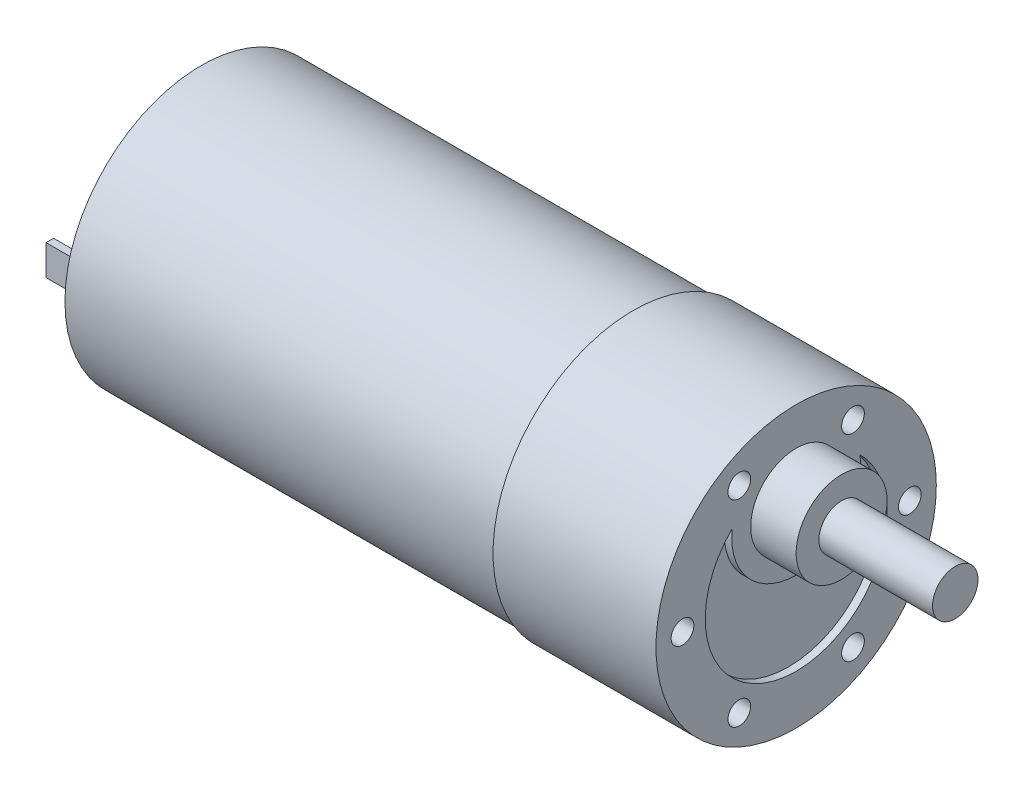
ISO-10303-21;
HEADER;
FILE_DESCRIPTION(('STEP AP214'),'2;1');
FILE_NAME('part.step','',(''),(''),'','','');
FILE_SCHEMA(('AUTOMOTIVE_DESIGN { 1 0 10303 214 1 1 1 1 }'));
ENDSEC;
DATA;
#1=APPLICATION_CONTEXT('core data for automotive mechanical design processes');
#2=APPLICATION_PROTOCOL_DEFINITION('international standard','automotive_design',2000,#1);
#3=PRODUCT_CONTEXT('',#1,'mechanical');
#4=PRODUCT('Part','Part','',(#3));
#5=PRODUCT_RELATED_PRODUCT_CATEGORY('part','',(#4));
#6=PRODUCT_DEFINITION_FORMATION('','',#4);
#7=PRODUCT_DEFINITION_CONTEXT('part definition',#1,'design');
#8=PRODUCT_DEFINITION('design','',#6,#7);
#9=PRODUCT_DEFINITION_SHAPE('','',#8);
#10=(LENGTH_UNIT() NAMED_UNIT(*) SI_UNIT(.MILLI.,.METRE.));
#11=(NAMED_UNIT(*) PLANE_ANGLE_UNIT() SI_UNIT($,.RADIAN.));
#12=(NAMED_UNIT(*) SI_UNIT($,.STERADIAN.) SOLID_ANGLE_UNIT());
#13=UNCERTAINTY_MEASURE_WITH_UNIT(LENGTH_MEASURE(1.E-05),#10,'distance_accuracy_value','');
#14=(GEOMETRIC_REPRESENTATION_CONTEXT(3) GLOBAL_UNCERTAINTY_ASSIGNED_CONTEXT((#13)) GLOBAL_UNIT_ASSIGNED_CONTEXT((#10,
#11,#12)) REPRESENTATION_CONTEXT('',''));
#15=CARTESIAN_POINT('',(0.,0.,0.));
#16=DIRECTION('',(0.,0.,1.));
#17=DIRECTION('',(1.,0.,0.));
#18=AXIS2_PLACEMENT_3D('',#15,#16,#17);
#19=CARTESIAN_POINT('',(21.5,0.,0.));
#20=DIRECTION('',(1.,0.,0.));
#21=DIRECTION('',(0.,0.,-1.));
#22=AXIS2_PLACEMENT_3D('',#19,#20,#21);
#23=PLANE('',#22);
#24=CARTESIAN_POINT('',(21.5,0.,15.));
#25=DIRECTION('',(1.,0.,0.));
#26=DIRECTION('',(0.,0.,-1.));
#27=AXIS2_PLACEMENT_3D('',#24,#25,#26);
#28=CIRCLE('',#27,1.5);
#29=CARTESIAN_POINT('',(21.5,0.,13.5));
#30=VERTEX_POINT('',#29);
#31=EDGE_CURVE('E423',#30,#30,#28,.T.);
#32=ORIENTED_EDGE('',*,*,#31,.F.);
#33=EDGE_LOOP('',(#32));
#34=FACE_BOUND('',#33,.T.);
#35=CARTESIAN_POINT('',(21.5,-12.9903810567665,7.50000000000015));
#36=DIRECTION('',(1.,0.,0.));
#37=DIRECTION('',(0.,0.,-1.));
#38=AXIS2_PLACEMENT_3D('',#35,#36,#37);
#39=CIRCLE('',#38,1.5);
#40=CARTESIAN_POINT('',(21.5,-12.9903810567665,6.00000000000014));
#41=VERTEX_POINT('',#40);
#42=EDGE_CURVE('E413',#41,#41,#39,.T.);
#43=ORIENTED_EDGE('',*,*,#42,.F.);
#44=EDGE_LOOP('',(#43));
#45=FACE_BOUND('',#44,.T.);
#46=CARTESIAN_POINT('',(21.5,-12.9903810567667,-7.49999999999988));
#47=DIRECTION('',(1.,0.,0.));
#48=DIRECTION('',(0.,0.,-1.));
#49=AXIS2_PLACEMENT_3D('',#46,#47,#48);
#50=CIRCLE('',#49,1.5);
#51=CARTESIAN_POINT('',(21.5,-12.9903810567667,-8.99999999999988));
#52=VERTEX_POINT('',#51);
#53=EDGE_CURVE('E403',#52,#52,#50,.T.);
#54=ORIENTED_EDGE('',*,*,#53,.F.);
#55=EDGE_LOOP('',(#54));
#56=FACE_BOUND('',#55,.T.);
#57=CARTESIAN_POINT('',(21.5,-1.02907469966573E-13,-15.));
#58=DIRECTION('',(1.,0.,0.));
#59=DIRECTION('',(0.,0.,-1.));
#60=AXIS2_PLACEMENT_3D('',#57,#58,#59);
#61=CIRCLE('',#60,1.5);
#62=CARTESIAN_POINT('',(21.5,-1.02907469966573E-13,-16.5));
#63=VERTEX_POINT('',#62);
#64=EDGE_CURVE('E410',#63,#63,#61,.T.);
#65=ORIENTED_EDGE('',*,*,#64,.F.);
#66=EDGE_LOOP('',(#65));
#67=FACE_BOUND('',#66,.T.);
#68=CARTESIAN_POINT('',(21.5,12.9903810567666,-7.50000000000006));
#69=DIRECTION('',(1.,0.,0.));
#70=DIRECTION('',(0.,0.,-1.));
#71=AXIS2_PLACEMENT_3D('',#68,#69,#70);
#72=CIRCLE('',#71,1.5);
#73=CARTESIAN_POINT('',(21.5,12.9903810567666,-9.00000000000006));
#74=VERTEX_POINT('',#73);
#75=EDGE_CURVE('E431',#74,#74,#72,.T.);
#76=ORIENTED_EDGE('',*,*,#75,.F.);
#77=EDGE_LOOP('',(#76));
#78=FACE_BOUND('',#77,.T.);
#79=CARTESIAN_POINT('',(21.5,12.9903810567666,7.49999999999997));
#80=DIRECTION('',(1.,0.,0.));
#81=DIRECTION('',(0.,0.,-1.));
#82=AXIS2_PLACEMENT_3D('',#79,#80,#81);
#83=CIRCLE('',#82,1.5);
#84=CARTESIAN_POINT('',(21.5,12.9903810567666,5.99999999999997));
#85=VERTEX_POINT('',#84);
#86=EDGE_CURVE('E435',#85,#85,#83,.T.);
#87=ORIENTED_EDGE('',*,*,#86,.F.);
#88=EDGE_LOOP('',(#87));
#89=FACE_BOUND('',#88,.T.);
#90=CARTESIAN_POINT('',(21.5,7.5,0.));
#91=DIRECTION('',(1.,0.,0.));
#92=DIRECTION('',(0.,0.,-1.));
#93=AXIS2_PLACEMENT_3D('',#90,#91,#92);
#94=CIRCLE('',#93,6.);
#95=CARTESIAN_POINT('',(21.5,7.5,-6.));
#96=VERTEX_POINT('',#95);
#97=EDGE_CURVE('E155',#96,#96,#94,.T.);
#98=ORIENTED_EDGE('',*,*,#97,.F.);
#99=EDGE_LOOP('',(#98));
#100=FACE_BOUND('',#99,.T.);
#101=CARTESIAN_POINT('',(21.5,0.,0.));
#102=DIRECTION('',(1.,0.,0.));
#103=DIRECTION('',(0.,0.,-1.));
#104=AXIS2_PLACEMENT_3D('',#101,#102,#103);
#105=CIRCLE('',#104,18.5);
#106=CARTESIAN_POINT('',(21.5,0.,-18.5));
#107=VERTEX_POINT('',#106);
#108=EDGE_CURVE('E51',#107,#107,#105,.T.);
#109=ORIENTED_EDGE('',*,*,#108,.T.);
#110=EDGE_LOOP('',(#109));
#111=FACE_BOUND('',#110,.T.);
#112=CARTESIAN_POINT('',(21.5,0.,0.));
#113=DIRECTION('',(1.,0.,0.));
#114=DIRECTION('',(0.,0.,-1.));
#115=AXIS2_PLACEMENT_3D('',#112,#113,#114);
#116=CIRCLE('',#115,12.);
#117=CARTESIAN_POINT('',(21.5,8.53333333333334,8.4369557437634));
#118=VERTEX_POINT('',#117);
#119=CARTESIAN_POINT('',(21.5,8.53333333333333,-8.4369557437634));
#120=VERTEX_POINT('',#119);
#121=EDGE_CURVE('E134',#118,#120,#116,.T.);
#122=ORIENTED_EDGE('',*,*,#121,.F.);
#123=CARTESIAN_POINT('',(21.5,7.5,0.));
#124=DIRECTION('',(1.,0.,0.));
#125=DIRECTION('',(0.,0.,-1.));
#126=AXIS2_PLACEMENT_3D('',#123,#124,#125);
#127=CIRCLE('',#126,8.5);
#128=EDGE_CURVE('E58',#118,#120,#127,.T.);
#129=ORIENTED_EDGE('',*,*,#128,.T.);
#130=EDGE_LOOP('',(#122,#129));
#131=FACE_BOUND('',#130,.T.);
#132=ADVANCED_FACE('F42',(#34,#45,#56,#67,#78,#89,#100,#111,#131),#23,.T.);
#133=CARTESIAN_POINT('',(-57.,0.,0.));
#134=DIRECTION('',(-1.,0.,0.));
#135=DIRECTION('',(0.,0.,1.));
#136=AXIS2_PLACEMENT_3D('',#133,#134,#135);
#137=PLANE('',#136);
#138=DIRECTION('',(0.,0.,-1.));
#139=VECTOR('',#138,1.);
#140=CARTESIAN_POINT('',(-57.,-2.00000000000001,-13.5));
#141=LINE('',#140,#139);
#142=CARTESIAN_POINT('',(-57.,-2.00000000000001,-13.5));
#143=VERTEX_POINT('',#142);
#144=CARTESIAN_POINT('',(-57.,-2.00000000000001,-14.5));
#145=VERTEX_POINT('',#144);
#146=EDGE_CURVE('E195',#143,#145,#141,.T.);
#147=ORIENTED_EDGE('',*,*,#146,.T.);
#148=DIRECTION('',(0.,1.,0.));
#149=VECTOR('',#148,1.);
#150=CARTESIAN_POINT('',(-57.,-2.00000000000001,-14.5));
#151=LINE('',#150,#149);
#152=CARTESIAN_POINT('',(-57.,1.99999999999999,-14.5));
#153=VERTEX_POINT('',#152);
#154=EDGE_CURVE('E225',#145,#153,#151,.T.);
#155=ORIENTED_EDGE('',*,*,#154,.T.);
#156=DIRECTION('',(0.,0.,-1.));
#157=VECTOR('',#156,1.);
#158=CARTESIAN_POINT('',(-57.,1.99999999999999,-13.5));
#159=LINE('',#158,#157);
#160=CARTESIAN_POINT('',(-57.,1.99999999999999,-13.5));
#161=VERTEX_POINT('',#160);
#162=EDGE_CURVE('E228',#161,#153,#159,.T.);
#163=ORIENTED_EDGE('',*,*,#162,.F.);
#164=DIRECTION('',(0.,1.,0.));
#165=VECTOR('',#164,1.);
#166=CARTESIAN_POINT('',(-57.,-2.00000000000001,-13.5));
#167=LINE('',#166,#165);
#168=EDGE_CURVE('E213',#143,#161,#167,.T.);
#169=ORIENTED_EDGE('',*,*,#168,.F.);
#170=EDGE_LOOP('',(#147,#155,#163,#169));
#171=FACE_BOUND('',#170,.T.);
#172=CARTESIAN_POINT('',(-57.,0.,0.));
#173=DIRECTION('',(-1.,0.,0.));
#174=DIRECTION('',(0.,0.,1.));
#175=AXIS2_PLACEMENT_3D('',#172,#173,#174);
#176=CIRCLE('',#175,18.);
#177=CARTESIAN_POINT('',(-57.,0.,-18.));
#178=VERTEX_POINT('',#177);
#179=EDGE_CURVE('E239',#178,#178,#176,.T.);
#180=ORIENTED_EDGE('',*,*,#179,.T.);
#181=EDGE_LOOP('',(#180));
#182=FACE_BOUND('',#181,.T.);
#183=DIRECTION('',(0.,1.,0.));
#184=VECTOR('',#183,1.);
#185=CARTESIAN_POINT('',(-57.,-2.,14.5));
#186=LINE('',#185,#184);
#187=CARTESIAN_POINT('',(-57.,-2.,14.5));
#188=VERTEX_POINT('',#187);
#189=CARTESIAN_POINT('',(-57.,2.,14.5));
#190=VERTEX_POINT('',#189);
#191=EDGE_CURVE('E66',#188,#190,#186,.T.);
#192=ORIENTED_EDGE('',*,*,#191,.F.);
#193=DIRECTION('',(0.,0.,1.));
#194=VECTOR('',#193,1.);
#195=CARTESIAN_POINT('',(-57.,-2.,13.5));
#196=LINE('',#195,#194);
#197=CARTESIAN_POINT('',(-57.,-2.,13.5));
#198=VERTEX_POINT('',#197);
#199=EDGE_CURVE('E191',#198,#188,#196,.T.);
#200=ORIENTED_EDGE('',*,*,#199,.F.);
#201=DIRECTION('',(0.,1.,0.));
#202=VECTOR('',#201,1.);
#203=CARTESIAN_POINT('',(-57.,-2.,13.5));
#204=LINE('',#203,#202);
#205=CARTESIAN_POINT('',(-57.,2.,13.5));
#206=VERTEX_POINT('',#205);
#207=EDGE_CURVE('E182',#198,#206,#204,.T.);
#208=ORIENTED_EDGE('',*,*,#207,.T.);
#209=DIRECTION('',(0.,0.,1.));
#210=VECTOR('',#209,1.);
#211=CARTESIAN_POINT('',(-57.,2.,13.5));
#212=LINE('',#211,#210);
#213=EDGE_CURVE('E185',#206,#190,#212,.T.);
#214=ORIENTED_EDGE('',*,*,#213,.T.);
#215=EDGE_LOOP('',(#192,#200,#208,#214));
#216=FACE_BOUND('',#215,.T.);
#217=ADVANCED_FACE('F273',(#171,#182,#216),#137,.T.);
#218=CARTESIAN_POINT('',(21.5,0.,0.));
#219=DIRECTION('',(-1.,0.,0.));
#220=DIRECTION('',(0.,0.,1.));
#221=AXIS2_PLACEMENT_3D('',#218,#219,#220);
#222=CYLINDRICAL_SURFACE('',#221,18.5);
#223=ORIENTED_EDGE('',*,*,#108,.F.);
#224=EDGE_LOOP('',(#223));
#225=FACE_BOUND('',#224,.T.);
#226=CARTESIAN_POINT('',(0.,0.,0.));
#227=DIRECTION('',(1.,0.,0.));
#228=DIRECTION('',(0.,0.,-1.));
#229=AXIS2_PLACEMENT_3D('',#226,#227,#228);
#230=CIRCLE('',#229,18.5);
#231=CARTESIAN_POINT('',(0.,0.,-18.5));
#232=VERTEX_POINT('',#231);
#233=EDGE_CURVE('E254',#232,#232,#230,.T.);
#234=ORIENTED_EDGE('',*,*,#233,.T.);
#235=EDGE_LOOP('',(#234));
#236=FACE_BOUND('',#235,.T.);
#237=ADVANCED_FACE('F44',(#225,#236),#222,.T.);
#238=CARTESIAN_POINT('',(0.,0.,0.));
#239=DIRECTION('',(1.,0.,0.));
#240=DIRECTION('',(0.,0.,-1.));
#241=AXIS2_PLACEMENT_3D('',#238,#239,#240);
#242=PLANE('',#241);
#243=CARTESIAN_POINT('',(0.,0.,0.));
#244=DIRECTION('',(1.,0.,0.));
#245=DIRECTION('',(0.,0.,-1.));
#246=AXIS2_PLACEMENT_3D('',#243,#244,#245);
#247=CIRCLE('',#246,18.);
#248=CARTESIAN_POINT('',(0.,0.,-18.));
#249=VERTEX_POINT('',#248);
#250=EDGE_CURVE('E11',#249,#249,#247,.F.);
#251=ORIENTED_EDGE('',*,*,#250,.F.);
#252=EDGE_LOOP('',(#251));
#253=FACE_BOUND('',#252,.T.);
#254=ORIENTED_EDGE('',*,*,#233,.F.);
#255=EDGE_LOOP('',(#254));
#256=FACE_BOUND('',#255,.T.);
#257=ADVANCED_FACE('F262',(#253,#256),#242,.F.);
#258=CARTESIAN_POINT('',(-57.,0.,0.));
#259=DIRECTION('',(1.,0.,0.));
#260=DIRECTION('',(0.,0.,-1.));
#261=AXIS2_PLACEMENT_3D('',#258,#259,#260);
#262=CYLINDRICAL_SURFACE('',#261,18.);
#263=CARTESIAN_POINT('',(-57.,0.,-18.));
#264=CARTESIAN_POINT('',(-56.40625,0.,-18.));
#265=CARTESIAN_POINT('',(-55.8125,0.,-18.));
#266=CARTESIAN_POINT('',(-54.625,0.,-18.));
#267=CARTESIAN_POINT('',(-54.03125,0.,-18.));
#268=CARTESIAN_POINT('',(-52.84375,0.,-18.));
#269=CARTESIAN_POINT('',(-52.25,0.,-18.));
#270=CARTESIAN_POINT('',(-51.0625,0.,-18.));
#271=CARTESIAN_POINT('',(-50.46875,0.,-18.));
#272=CARTESIAN_POINT('',(-49.28125,0.,-18.));
#273=CARTESIAN_POINT('',(-48.6875,0.,-18.));
#274=CARTESIAN_POINT('',(-47.5,0.,-18.));
#275=CARTESIAN_POINT('',(-46.90625,0.,-18.));
#276=CARTESIAN_POINT('',(-45.71875,0.,-18.));
#277=CARTESIAN_POINT('',(-45.125,0.,-18.));
#278=CARTESIAN_POINT('',(-43.9375,0.,-18.));
#279=CARTESIAN_POINT('',(-43.34375,0.,-18.));
#280=CARTESIAN_POINT('',(-42.15625,0.,-18.));
#281=CARTESIAN_POINT('',(-41.5625,0.,-18.));
#282=CARTESIAN_POINT('',(-40.375,0.,-18.));
#283=CARTESIAN_POINT('',(-39.78125,0.,-18.));
#284=CARTESIAN_POINT('',(-38.59375,0.,-18.));
#285=CARTESIAN_POINT('',(-38.,0.,-18.));
#286=CARTESIAN_POINT('',(-36.8125,0.,-18.));
#287=CARTESIAN_POINT('',(-36.21875,0.,-18.));
#288=CARTESIAN_POINT('',(-35.03125,0.,-18.));
#289=CARTESIAN_POINT('',(-34.4375,0.,-18.));
#290=CARTESIAN_POINT('',(-33.25,0.,-18.));
#291=CARTESIAN_POINT('',(-32.65625,0.,-18.));
#292=CARTESIAN_POINT('',(-31.46875,0.,-18.));
#293=CARTESIAN_POINT('',(-30.875,0.,-18.));
#294=CARTESIAN_POINT('',(-29.6875,0.,-18.));
#295=CARTESIAN_POINT('',(-29.09375,0.,-18.));
#296=CARTESIAN_POINT('',(-27.90625,0.,-18.));
#297=CARTESIAN_POINT('',(-27.3125,0.,-18.));
#298=CARTESIAN_POINT('',(-26.125,0.,-18.));
#299=CARTESIAN_POINT('',(-25.53125,0.,-18.));
#300=CARTESIAN_POINT('',(-24.34375,0.,-18.));
#301=CARTESIAN_POINT('',(-23.75,0.,-18.));
#302=CARTESIAN_POINT('',(-22.5625,0.,-18.));
#303=CARTESIAN_POINT('',(-21.96875,0.,-18.));
#304=CARTESIAN_POINT('',(-20.78125,0.,-18.));
#305=CARTESIAN_POINT('',(-20.1875,0.,-18.));
#306=CARTESIAN_POINT('',(-19.,0.,-18.));
#307=CARTESIAN_POINT('',(-18.40625,0.,-18.));
#308=CARTESIAN_POINT('',(-17.21875,0.,-18.));
#309=CARTESIAN_POINT('',(-16.625,0.,-18.));
#310=CARTESIAN_POINT('',(-15.4375,0.,-18.));
#311=CARTESIAN_POINT('',(-14.84375,0.,-18.));
#312=CARTESIAN_POINT('',(-13.65625,0.,-18.));
#313=CARTESIAN_POINT('',(-13.0625,0.,-18.));
#314=CARTESIAN_POINT('',(-11.875,0.,-18.));
#315=CARTESIAN_POINT('',(-11.28125,0.,-18.));
#316=CARTESIAN_POINT('',(-10.09375,0.,-18.));
#317=CARTESIAN_POINT('',(-9.5,0.,-18.));
#318=CARTESIAN_POINT('',(-8.3125,0.,-18.));
#319=CARTESIAN_POINT('',(-7.71875,0.,-18.));
#320=CARTESIAN_POINT('',(-6.53125,0.,-18.));
#321=CARTESIAN_POINT('',(-5.9375,0.,-18.));
#322=CARTESIAN_POINT('',(-4.75,0.,-18.));
#323=CARTESIAN_POINT('',(-4.15625,0.,-18.));
#324=CARTESIAN_POINT('',(-2.96875,0.,-18.));
#325=CARTESIAN_POINT('',(-2.375,0.,-18.));
#326=CARTESIAN_POINT('',(-1.1875,0.,-18.));
#327=CARTESIAN_POINT('',(-0.593749999999999,0.,-18.));
#328=CARTESIAN_POINT('',(0.,0.,-18.));
#329=B_SPLINE_CURVE_WITH_KNOTS('',3,(#263,#264,#265,#266,#267,#268,#269,#270,#271,#272,#273,
#274,#275,#276,#277,#278,#279,#280,#281,#282,#283,#284,#285,#286,#287,#288,#289,#290,#291,#292,
#293,#294,#295,#296,#297,#298,#299,#300,#301,#302,#303,#304,#305,#306,#307,#308,#309,#310,#311,
#312,#313,#314,#315,#316,#317,#318,#319,#320,#321,#322,#323,#324,#325,#326,#327,#328),
.UNSPECIFIED.,.F.,.F.,(4,2,2,2,2,2,2,2,2,2,2,2,2,2,2,2,2,2,2,2,2,2,2,2,2,2,2,2,2,2,2,2,4),(0.,
1.78125000000001,3.5625,5.34375,7.12500000000001,8.90625,10.6875,12.46875,14.25,16.03125,
17.8125,19.59375,21.375,23.15625,24.9375,26.71875,28.5,30.28125,32.0625,33.84375,35.625,
37.40625,39.1875,40.96875,42.75,44.53125,46.3125,48.09375,49.875,51.65625,53.4375,55.21875,57.),.UNSPECIFIED.);
#330=EDGE_CURVE('BSEAM264',#178,#249,#329,.T.);
#331=ORIENTED_EDGE('',*,*,#179,.F.);
#332=ORIENTED_EDGE('',*,*,#250,.T.);
#333=ORIENTED_EDGE('',*,*,#330,.T.);
#334=ORIENTED_EDGE('',*,*,#330,.F.);
#335=EDGE_LOOP('',(#331,#333,#332,#334));
#336=FACE_BOUND('',#335,.T.);
#337=ADVANCED_FACE('F264',(#336),#262,.T.);
#338=CARTESIAN_POINT('',(-63.,-2.00000000000001,-13.5));
#339=DIRECTION('',(0.,-1.,0.));
#340=DIRECTION('',(0.,0.,-1.));
#341=AXIS2_PLACEMENT_3D('',#338,#339,#340);
#342=PLANE('',#341);
#343=ORIENTED_EDGE('',*,*,#146,.F.);
#344=DIRECTION('',(1.,0.,0.));
#345=VECTOR('',#344,1.);
#346=CARTESIAN_POINT('',(-63.,-2.00000000000001,-13.5));
#347=LINE('',#346,#345);
#348=CARTESIAN_POINT('',(-63.,-2.00000000000001,-13.5));
#349=VERTEX_POINT('',#348);
#350=EDGE_CURVE('E235',#349,#143,#347,.T.);
#351=ORIENTED_EDGE('',*,*,#350,.F.);
#352=DIRECTION('',(0.,0.,-1.));
#353=VECTOR('',#352,1.);
#354=CARTESIAN_POINT('',(-63.,-2.00000000000001,-13.5));
#355=LINE('',#354,#353);
#356=CARTESIAN_POINT('',(-63.,-2.00000000000001,-14.5));
#357=VERTEX_POINT('',#356);
#358=EDGE_CURVE('E208',#349,#357,#355,.T.);
#359=ORIENTED_EDGE('',*,*,#358,.T.);
#360=DIRECTION('',(1.,0.,0.));
#361=VECTOR('',#360,1.);
#362=CARTESIAN_POINT('',(-63.,-2.00000000000001,-14.5));
#363=LINE('',#362,#361);
#364=EDGE_CURVE('E223',#357,#145,#363,.T.);
#365=ORIENTED_EDGE('',*,*,#364,.T.);
#366=EDGE_LOOP('',(#343,#351,#359,#365));
#367=FACE_BOUND('',#366,.T.);
#368=ADVANCED_FACE('F270',(#367),#342,.T.);
#369=CARTESIAN_POINT('',(-63.,-2.00000000000001,-13.5));
#370=DIRECTION('',(0.,0.,-1.));
#371=DIRECTION('',(-1.,0.,0.));
#372=AXIS2_PLACEMENT_3D('',#369,#370,#371);
#373=PLANE('',#372);
#374=ORIENTED_EDGE('',*,*,#168,.T.);
#375=DIRECTION('',(1.,0.,0.));
#376=VECTOR('',#375,1.);
#377=CARTESIAN_POINT('',(-63.,1.99999999999999,-13.5));
#378=LINE('',#377,#376);
#379=CARTESIAN_POINT('',(-63.,1.99999999999999,-13.5));
#380=VERTEX_POINT('',#379);
#381=EDGE_CURVE('E240',#380,#161,#378,.T.);
#382=ORIENTED_EDGE('',*,*,#381,.F.);
#383=DIRECTION('',(0.,1.,0.));
#384=VECTOR('',#383,1.);
#385=CARTESIAN_POINT('',(-63.,-2.00000000000001,-13.5));
#386=LINE('',#385,#384);
#387=EDGE_CURVE('E220',#349,#380,#386,.T.);
#388=ORIENTED_EDGE('',*,*,#387,.F.);
#389=ORIENTED_EDGE('',*,*,#350,.T.);
#390=EDGE_LOOP('',(#374,#382,#388,#389));
#391=FACE_BOUND('',#390,.T.);
#392=ADVANCED_FACE('F289',(#391),#373,.F.);
#393=CARTESIAN_POINT('',(-63.,1.99999999999999,-13.5));
#394=DIRECTION('',(0.,-1.,0.));
#395=DIRECTION('',(0.,0.,-1.));
#396=AXIS2_PLACEMENT_3D('',#393,#394,#395);
#397=PLANE('',#396);
#398=ORIENTED_EDGE('',*,*,#162,.T.);
#399=DIRECTION('',(1.,0.,0.));
#400=VECTOR('',#399,1.);
#401=CARTESIAN_POINT('',(-63.,1.99999999999999,-14.5));
#402=LINE('',#401,#400);
#403=CARTESIAN_POINT('',(-63.,1.99999999999999,-14.5));
#404=VERTEX_POINT('',#403);
#405=EDGE_CURVE('E244',#404,#153,#402,.T.);
#406=ORIENTED_EDGE('',*,*,#405,.F.);
#407=DIRECTION('',(0.,0.,-1.));
#408=VECTOR('',#407,1.);
#409=CARTESIAN_POINT('',(-63.,1.99999999999999,-13.5));
#410=LINE('',#409,#408);
#411=EDGE_CURVE('E217',#380,#404,#410,.T.);
#412=ORIENTED_EDGE('',*,*,#411,.F.);
#413=ORIENTED_EDGE('',*,*,#381,.T.);
#414=EDGE_LOOP('',(#398,#406,#412,#413));
#415=FACE_BOUND('',#414,.T.);
#416=ADVANCED_FACE('F295',(#415),#397,.F.);
#417=CARTESIAN_POINT('',(-63.,-2.00000000000001,-14.5));
#418=DIRECTION('',(0.,0.,-1.));
#419=DIRECTION('',(-1.,0.,0.));
#420=AXIS2_PLACEMENT_3D('',#417,#418,#419);
#421=PLANE('',#420);
#422=ORIENTED_EDGE('',*,*,#154,.F.);
#423=ORIENTED_EDGE('',*,*,#364,.F.);
#424=DIRECTION('',(0.,1.,0.));
#425=VECTOR('',#424,1.);
#426=CARTESIAN_POINT('',(-63.,-2.00000000000001,-14.5));
#427=LINE('',#426,#425);
#428=EDGE_CURVE('E212',#357,#404,#427,.T.);
#429=ORIENTED_EDGE('',*,*,#428,.T.);
#430=ORIENTED_EDGE('',*,*,#405,.T.);
#431=EDGE_LOOP('',(#422,#423,#429,#430));
#432=FACE_BOUND('',#431,.T.);
#433=ADVANCED_FACE('F291',(#432),#421,.T.);
#434=CARTESIAN_POINT('',(-63.,0.,0.));
#435=DIRECTION('',(1.,0.,0.));
#436=DIRECTION('',(0.,0.,-1.));
#437=AXIS2_PLACEMENT_3D('',#434,#435,#436);
#438=PLANE('',#437);
#439=ORIENTED_EDGE('',*,*,#358,.F.);
#440=ORIENTED_EDGE('',*,*,#387,.T.);
#441=ORIENTED_EDGE('',*,*,#411,.T.);
#442=ORIENTED_EDGE('',*,*,#428,.F.);
#443=EDGE_LOOP('',(#439,#440,#441,#442));
#444=FACE_BOUND('',#443,.T.);
#445=ADVANCED_FACE('F294',(#444),#438,.F.);
#446=CARTESIAN_POINT('',(-63.,-2.,13.5));
#447=DIRECTION('',(0.,1.,0.));
#448=DIRECTION('',(0.,0.,1.));
#449=AXIS2_PLACEMENT_3D('',#446,#447,#448);
#450=PLANE('',#449);
#451=ORIENTED_EDGE('',*,*,#199,.T.);
#452=DIRECTION('',(1.,0.,0.));
#453=VECTOR('',#452,1.);
#454=CARTESIAN_POINT('',(-63.,-2.,14.5));
#455=LINE('',#454,#453);
#456=CARTESIAN_POINT('',(-63.,-2.,14.5));
#457=VERTEX_POINT('',#456);
#458=EDGE_CURVE('E163',#457,#188,#455,.T.);
#459=ORIENTED_EDGE('',*,*,#458,.F.);
#460=DIRECTION('',(0.,0.,1.));
#461=VECTOR('',#460,1.);
#462=CARTESIAN_POINT('',(-63.,-2.,13.5));
#463=LINE('',#462,#461);
#464=CARTESIAN_POINT('',(-63.,-2.,13.5));
#465=VERTEX_POINT('',#464);
#466=EDGE_CURVE('E186',#465,#457,#463,.T.);
#467=ORIENTED_EDGE('',*,*,#466,.F.);
#468=DIRECTION('',(1.,0.,0.));
#469=VECTOR('',#468,1.);
#470=CARTESIAN_POINT('',(-63.,-2.,13.5));
#471=LINE('',#470,#469);
#472=EDGE_CURVE('E177',#465,#198,#471,.T.);
#473=ORIENTED_EDGE('',*,*,#472,.T.);
#474=EDGE_LOOP('',(#451,#459,#467,#473));
#475=FACE_BOUND('',#474,.T.);
#476=ADVANCED_FACE('F305',(#475),#450,.F.);
#477=CARTESIAN_POINT('',(-63.,-2.,14.5));
#478=DIRECTION('',(0.,0.,-1.));
#479=DIRECTION('',(-1.,0.,0.));
#480=AXIS2_PLACEMENT_3D('',#477,#478,#479);
#481=PLANE('',#480);
#482=ORIENTED_EDGE('',*,*,#191,.T.);
#483=DIRECTION('',(1.,0.,0.));
#484=VECTOR('',#483,1.);
#485=CARTESIAN_POINT('',(-63.,2.,14.5));
#486=LINE('',#485,#484);
#487=CARTESIAN_POINT('',(-63.,2.,14.5));
#488=VERTEX_POINT('',#487);
#489=EDGE_CURVE('E169',#488,#190,#486,.T.);
#490=ORIENTED_EDGE('',*,*,#489,.F.);
#491=DIRECTION('',(0.,1.,0.));
#492=VECTOR('',#491,1.);
#493=CARTESIAN_POINT('',(-63.,-2.,14.5));
#494=LINE('',#493,#492);
#495=EDGE_CURVE('E203',#457,#488,#494,.T.);
#496=ORIENTED_EDGE('',*,*,#495,.F.);
#497=ORIENTED_EDGE('',*,*,#458,.T.);
#498=EDGE_LOOP('',(#482,#490,#496,#497));
#499=FACE_BOUND('',#498,.T.);
#500=ADVANCED_FACE('F319',(#499),#481,.F.);
#501=CARTESIAN_POINT('',(-63.,2.,13.5));
#502=DIRECTION('',(0.,1.,0.));
#503=DIRECTION('',(0.,0.,1.));
#504=AXIS2_PLACEMENT_3D('',#501,#502,#503);
#505=PLANE('',#504);
#506=ORIENTED_EDGE('',*,*,#213,.F.);
#507=DIRECTION('',(1.,0.,0.));
#508=VECTOR('',#507,1.);
#509=CARTESIAN_POINT('',(-63.,2.,13.5));
#510=LINE('',#509,#508);
#511=CARTESIAN_POINT('',(-63.,2.,13.5));
#512=VERTEX_POINT('',#511);
#513=EDGE_CURVE('E173',#512,#206,#510,.T.);
#514=ORIENTED_EDGE('',*,*,#513,.F.);
#515=DIRECTION('',(0.,0.,1.));
#516=VECTOR('',#515,1.);
#517=CARTESIAN_POINT('',(-63.,2.,13.5));
#518=LINE('',#517,#516);
#519=EDGE_CURVE('E199',#512,#488,#518,.T.);
#520=ORIENTED_EDGE('',*,*,#519,.T.);
#521=ORIENTED_EDGE('',*,*,#489,.T.);
#522=EDGE_LOOP('',(#506,#514,#520,#521));
#523=FACE_BOUND('',#522,.T.);
#524=ADVANCED_FACE('F315',(#523),#505,.T.);
#525=CARTESIAN_POINT('',(-63.,-2.,13.5));
#526=DIRECTION('',(0.,0.,-1.));
#527=DIRECTION('',(-1.,0.,0.));
#528=AXIS2_PLACEMENT_3D('',#525,#526,#527);
#529=PLANE('',#528);
#530=ORIENTED_EDGE('',*,*,#207,.F.);
#531=ORIENTED_EDGE('',*,*,#472,.F.);
#532=DIRECTION('',(0.,1.,0.));
#533=VECTOR('',#532,1.);
#534=CARTESIAN_POINT('',(-63.,-2.,13.5));
#535=LINE('',#534,#533);
#536=EDGE_CURVE('E181',#465,#512,#535,.T.);
#537=ORIENTED_EDGE('',*,*,#536,.T.);
#538=ORIENTED_EDGE('',*,*,#513,.T.);
#539=EDGE_LOOP('',(#530,#531,#537,#538));
#540=FACE_BOUND('',#539,.T.);
#541=ADVANCED_FACE('F311',(#540),#529,.T.);
#542=CARTESIAN_POINT('',(-63.,0.,0.));
#543=DIRECTION('',(-1.,0.,0.));
#544=DIRECTION('',(0.,0.,1.));
#545=AXIS2_PLACEMENT_3D('',#542,#543,#544);
#546=PLANE('',#545);
#547=ORIENTED_EDGE('',*,*,#466,.T.);
#548=ORIENTED_EDGE('',*,*,#495,.T.);
#549=ORIENTED_EDGE('',*,*,#519,.F.);
#550=ORIENTED_EDGE('',*,*,#536,.F.);
#551=EDGE_LOOP('',(#547,#548,#549,#550));
#552=FACE_BOUND('',#551,.T.);
#553=ADVANCED_FACE('F307',(#552),#546,.T.);
#554=CARTESIAN_POINT('',(27.5,7.5,0.));
#555=DIRECTION('',(-1.,0.,0.));
#556=DIRECTION('',(0.,0.,1.));
#557=AXIS2_PLACEMENT_3D('',#554,#555,#556);
#558=CYLINDRICAL_SURFACE('',#557,6.);
#559=CARTESIAN_POINT('',(27.5,7.5,0.));
#560=DIRECTION('',(1.,0.,0.));
#561=DIRECTION('',(0.,0.,-1.));
#562=AXIS2_PLACEMENT_3D('',#559,#560,#561);
#563=CIRCLE('',#562,6.);
#564=CARTESIAN_POINT('',(27.5,7.5,-6.));
#565=VERTEX_POINT('',#564);
#566=EDGE_CURVE('E159',#565,#565,#563,.T.);
#567=ORIENTED_EDGE('',*,*,#566,.F.);
#568=EDGE_LOOP('',(#567));
#569=FACE_BOUND('',#568,.T.);
#570=ORIENTED_EDGE('',*,*,#97,.T.);
#571=EDGE_LOOP('',(#570));
#572=FACE_BOUND('',#571,.T.);
#573=ADVANCED_FACE('F310',(#569,#572),#558,.T.);
#574=CARTESIAN_POINT('',(27.5,0.,0.));
#575=DIRECTION('',(1.,0.,0.));
#576=DIRECTION('',(0.,0.,-1.));
#577=AXIS2_PLACEMENT_3D('',#574,#575,#576);
#578=PLANE('',#577);
#579=CARTESIAN_POINT('',(27.5,7.5,0.));
#580=DIRECTION('',(1.,0.,0.));
#581=DIRECTION('',(0.,0.,-1.));
#582=AXIS2_PLACEMENT_3D('',#579,#580,#581);
#583=CIRCLE('',#582,3.);
#584=CARTESIAN_POINT('',(27.5,7.5,-3.));
#585=VERTEX_POINT('',#584);
#586=EDGE_CURVE('E149',#585,#585,#583,.T.);
#587=ORIENTED_EDGE('',*,*,#586,.F.);
#588=EDGE_LOOP('',(#587));
#589=FACE_BOUND('',#588,.T.);
#590=ORIENTED_EDGE('',*,*,#566,.T.);
#591=EDGE_LOOP('',(#590));
#592=FACE_BOUND('',#591,.T.);
#593=ADVANCED_FACE('F329',(#589,#592),#578,.T.);
#594=CARTESIAN_POINT('',(42.5,7.5,0.));
#595=DIRECTION('',(-1.,0.,0.));
#596=DIRECTION('',(0.,0.,1.));
#597=AXIS2_PLACEMENT_3D('',#594,#595,#596);
#598=CYLINDRICAL_SURFACE('',#597,3.);
#599=CARTESIAN_POINT('',(42.5,7.5,0.));
#600=DIRECTION('',(1.,0.,0.));
#601=DIRECTION('',(0.,0.,-1.));
#602=AXIS2_PLACEMENT_3D('',#599,#600,#601);
#603=CIRCLE('',#602,3.);
#604=CARTESIAN_POINT('',(42.5,7.5,-3.));
#605=VERTEX_POINT('',#604);
#606=EDGE_CURVE('E151',#605,#605,#603,.T.);
#607=ORIENTED_EDGE('',*,*,#606,.F.);
#608=EDGE_LOOP('',(#607));
#609=FACE_BOUND('',#608,.T.);
#610=ORIENTED_EDGE('',*,*,#586,.T.);
#611=EDGE_LOOP('',(#610));
#612=FACE_BOUND('',#611,.T.);
#613=ADVANCED_FACE('F333',(#609,#612),#598,.T.);
#614=CARTESIAN_POINT('',(42.5,7.5,0.));
#615=DIRECTION('',(1.,0.,0.));
#616=DIRECTION('',(0.,0.,-1.));
#617=AXIS2_PLACEMENT_3D('',#614,#615,#616);
#618=PLANE('',#617);
#619=ORIENTED_EDGE('',*,*,#606,.T.);
#620=EDGE_LOOP('',(#619));
#621=FACE_BOUND('',#620,.T.);
#622=ADVANCED_FACE('F337',(#621),#618,.T.);
#623=CARTESIAN_POINT('',(20.5,7.5,0.));
#624=DIRECTION('',(1.,0.,0.));
#625=DIRECTION('',(0.,0.,-1.));
#626=AXIS2_PLACEMENT_3D('',#623,#624,#625);
#627=CYLINDRICAL_SURFACE('',#626,8.5);
#628=ORIENTED_EDGE('',*,*,#128,.F.);
#629=DIRECTION('',(1.,0.,0.));
#630=VECTOR('',#629,1.);
#631=CARTESIAN_POINT('',(20.5,8.53333333333334,8.4369557437634));
#632=LINE('',#631,#630);
#633=CARTESIAN_POINT('',(20.5,8.53333333333334,8.4369557437634));
#634=VERTEX_POINT('',#633);
#635=EDGE_CURVE('E117',#634,#118,#632,.T.);
#636=ORIENTED_EDGE('',*,*,#635,.F.);
#637=CARTESIAN_POINT('',(20.5,7.5,0.));
#638=DIRECTION('',(1.,0.,0.));
#639=DIRECTION('',(0.,0.,-1.));
#640=AXIS2_PLACEMENT_3D('',#637,#638,#639);
#641=CIRCLE('',#640,8.5);
#642=CARTESIAN_POINT('',(20.5,8.53333333333333,-8.4369557437634));
#643=VERTEX_POINT('',#642);
#644=EDGE_CURVE('E120',#634,#643,#641,.T.);
#645=ORIENTED_EDGE('',*,*,#644,.T.);
#646=DIRECTION('',(1.,0.,0.));
#647=VECTOR('',#646,1.);
#648=CARTESIAN_POINT('',(20.5,8.53333333333333,-8.4369557437634));
#649=LINE('',#648,#647);
#650=EDGE_CURVE('E127',#643,#120,#649,.T.);
#651=ORIENTED_EDGE('',*,*,#650,.T.);
#652=EDGE_LOOP('',(#628,#636,#645,#651));
#653=FACE_BOUND('',#652,.T.);
#654=ADVANCED_FACE('F119',(#653),#627,.T.);
#655=CARTESIAN_POINT('',(20.5,0.,0.));
#656=DIRECTION('',(1.,0.,0.));
#657=DIRECTION('',(0.,0.,-1.));
#658=AXIS2_PLACEMENT_3D('',#655,#656,#657);
#659=CYLINDRICAL_SURFACE('',#658,12.);
#660=ORIENTED_EDGE('',*,*,#121,.T.);
#661=ORIENTED_EDGE('',*,*,#650,.F.);
#662=CARTESIAN_POINT('',(20.5,0.,0.));
#663=DIRECTION('',(1.,0.,0.));
#664=DIRECTION('',(0.,0.,-1.));
#665=AXIS2_PLACEMENT_3D('',#662,#663,#664);
#666=CIRCLE('',#665,12.);
#667=EDGE_CURVE('E128',#634,#643,#666,.T.);
#668=ORIENTED_EDGE('',*,*,#667,.F.);
#669=ORIENTED_EDGE('',*,*,#635,.T.);
#670=EDGE_LOOP('',(#660,#661,#668,#669));
#671=FACE_BOUND('',#670,.T.);
#672=ADVANCED_FACE('F136',(#671),#659,.F.);
#673=CARTESIAN_POINT('',(20.5,0.,0.));
#674=DIRECTION('',(1.,0.,0.));
#675=DIRECTION('',(0.,0.,-1.));
#676=AXIS2_PLACEMENT_3D('',#673,#674,#675);
#677=PLANE('',#676);
#678=ORIENTED_EDGE('',*,*,#644,.F.);
#679=ORIENTED_EDGE('',*,*,#667,.T.);
#680=EDGE_LOOP('',(#678,#679));
#681=FACE_BOUND('',#680,.T.);
#682=ADVANCED_FACE('F132',(#681),#677,.T.);
#683=CARTESIAN_POINT('',(16.5,12.9903810567666,7.49999999999997));
#684=DIRECTION('',(1.,0.,0.));
#685=DIRECTION('',(0.,0.,-1.));
#686=AXIS2_PLACEMENT_3D('',#683,#684,#685);
#687=CYLINDRICAL_SURFACE('',#686,1.5);
#688=CARTESIAN_POINT('',(16.5,12.9903810567666,7.49999999999997));
#689=DIRECTION('',(1.,0.,0.));
#690=DIRECTION('',(0.,0.,-1.));
#691=AXIS2_PLACEMENT_3D('',#688,#689,#690);
#692=CIRCLE('',#691,1.5);
#693=CARTESIAN_POINT('',(16.5,12.9903810567666,5.99999999999997));
#694=VERTEX_POINT('',#693);
#695=EDGE_CURVE('E145',#694,#694,#692,.T.);
#696=ORIENTED_EDGE('',*,*,#695,.F.);
#697=EDGE_LOOP('',(#696));
#698=FACE_BOUND('',#697,.T.);
#699=ORIENTED_EDGE('',*,*,#86,.T.);
#700=EDGE_LOOP('',(#699));
#701=FACE_BOUND('',#700,.T.);
#702=ADVANCED_FACE('F348',(#698,#701),#687,.F.);
#703=CARTESIAN_POINT('',(16.5,12.9903810567666,7.49999999999997));
#704=DIRECTION('',(1.,0.,0.));
#705=DIRECTION('',(0.,0.,-1.));
#706=AXIS2_PLACEMENT_3D('',#703,#704,#705);
#707=PLANE('',#706);
#708=ORIENTED_EDGE('',*,*,#695,.T.);
#709=EDGE_LOOP('',(#708));
#710=FACE_BOUND('',#709,.T.);
#711=ADVANCED_FACE('F351',(#710),#707,.T.);
#712=CARTESIAN_POINT('',(16.5,12.9903810567666,-7.50000000000006));
#713=DIRECTION('',(1.,0.,0.));
#714=DIRECTION('',(0.,0.,-1.));
#715=AXIS2_PLACEMENT_3D('',#712,#713,#714);
#716=CYLINDRICAL_SURFACE('',#715,1.5);
#717=CARTESIAN_POINT('',(16.5,12.9903810567666,-7.50000000000006));
#718=DIRECTION('',(1.,0.,0.));
#719=DIRECTION('',(0.,0.,-1.));
#720=AXIS2_PLACEMENT_3D('',#717,#718,#719);
#721=CIRCLE('',#720,1.5);
#722=CARTESIAN_POINT('',(16.5,12.9903810567666,-9.00000000000006));
#723=VERTEX_POINT('',#722);
#724=EDGE_CURVE('E436',#723,#723,#721,.T.);
#725=ORIENTED_EDGE('',*,*,#724,.F.);
#726=EDGE_LOOP('',(#725));
#727=FACE_BOUND('',#726,.T.);
#728=ORIENTED_EDGE('',*,*,#75,.T.);
#729=EDGE_LOOP('',(#728));
#730=FACE_BOUND('',#729,.T.);
#731=ADVANCED_FACE('F355',(#727,#730),#716,.F.);
#732=CARTESIAN_POINT('',(16.5,12.9903810567666,-7.50000000000006));
#733=DIRECTION('',(1.,0.,0.));
#734=DIRECTION('',(0.,0.,-1.));
#735=AXIS2_PLACEMENT_3D('',#732,#733,#734);
#736=PLANE('',#735);
#737=ORIENTED_EDGE('',*,*,#724,.T.);
#738=EDGE_LOOP('',(#737));
#739=FACE_BOUND('',#738,.T.);
#740=ADVANCED_FACE('F365',(#739),#736,.T.);
#741=CARTESIAN_POINT('',(16.5,-1.02907469966573E-13,-15.));
#742=DIRECTION('',(1.,0.,0.));
#743=DIRECTION('',(0.,0.,-1.));
#744=AXIS2_PLACEMENT_3D('',#741,#742,#743);
#745=CYLINDRICAL_SURFACE('',#744,1.5);
#746=CARTESIAN_POINT('',(16.5,-1.02907469966573E-13,-15.));
#747=DIRECTION('',(1.,0.,0.));
#748=DIRECTION('',(0.,0.,-1.));
#749=AXIS2_PLACEMENT_3D('',#746,#747,#748);
#750=CIRCLE('',#749,1.5);
#751=CARTESIAN_POINT('',(16.5,-1.02907469966573E-13,-16.5));
#752=VERTEX_POINT('',#751);
#753=EDGE_CURVE('E406',#752,#752,#750,.T.);
#754=ORIENTED_EDGE('',*,*,#753,.F.);
#755=EDGE_LOOP('',(#754));
#756=FACE_BOUND('',#755,.T.);
#757=ORIENTED_EDGE('',*,*,#64,.T.);
#758=EDGE_LOOP('',(#757));
#759=FACE_BOUND('',#758,.T.);
#760=ADVANCED_FACE('F361',(#756,#759),#745,.F.);
#761=CARTESIAN_POINT('',(16.5,-1.02907469966573E-13,-15.));
#762=DIRECTION('',(1.,0.,0.));
#763=DIRECTION('',(0.,0.,-1.));
#764=AXIS2_PLACEMENT_3D('',#761,#762,#763);
#765=PLANE('',#764);
#766=ORIENTED_EDGE('',*,*,#753,.T.);
#767=EDGE_LOOP('',(#766));
#768=FACE_BOUND('',#767,.T.);
#769=ADVANCED_FACE('F357',(#768),#765,.T.);
#770=CARTESIAN_POINT('',(16.5,-12.9903810567667,-7.49999999999988));
#771=DIRECTION('',(1.,0.,0.));
#772=DIRECTION('',(0.,0.,-1.));
#773=AXIS2_PLACEMENT_3D('',#770,#771,#772);
#774=CYLINDRICAL_SURFACE('',#773,1.5);
#775=CARTESIAN_POINT('',(16.5,-12.9903810567667,-7.49999999999988));
#776=DIRECTION('',(1.,0.,0.));
#777=DIRECTION('',(0.,0.,-1.));
#778=AXIS2_PLACEMENT_3D('',#775,#776,#777);
#779=CIRCLE('',#778,1.5);
#780=CARTESIAN_POINT('',(16.5,-12.9903810567667,-8.99999999999988));
#781=VERTEX_POINT('',#780);
#782=EDGE_CURVE('E400',#781,#781,#779,.T.);
#783=ORIENTED_EDGE('',*,*,#782,.F.);
#784=EDGE_LOOP('',(#783));
#785=FACE_BOUND('',#784,.T.);
#786=ORIENTED_EDGE('',*,*,#53,.T.);
#787=EDGE_LOOP('',(#786));
#788=FACE_BOUND('',#787,.T.);
#789=ADVANCED_FACE('F360',(#785,#788),#774,.F.);
#790=CARTESIAN_POINT('',(16.5,-12.9903810567667,-7.49999999999988));
#791=DIRECTION('',(1.,0.,0.));
#792=DIRECTION('',(0.,0.,-1.));
#793=AXIS2_PLACEMENT_3D('',#790,#791,#792);
#794=PLANE('',#793);
#795=ORIENTED_EDGE('',*,*,#782,.T.);
#796=EDGE_LOOP('',(#795));
#797=FACE_BOUND('',#796,.T.);
#798=ADVANCED_FACE('F388',(#797),#794,.T.);
#799=CARTESIAN_POINT('',(16.5,-12.9903810567665,7.50000000000015));
#800=DIRECTION('',(1.,0.,0.));
#801=DIRECTION('',(0.,0.,-1.));
#802=AXIS2_PLACEMENT_3D('',#799,#800,#801);
#803=CYLINDRICAL_SURFACE('',#802,1.5);
#804=CARTESIAN_POINT('',(16.5,-12.9903810567665,7.50000000000015));
#805=DIRECTION('',(1.,0.,0.));
#806=DIRECTION('',(0.,0.,-1.));
#807=AXIS2_PLACEMENT_3D('',#804,#805,#806);
#808=CIRCLE('',#807,1.5);
#809=CARTESIAN_POINT('',(16.5,-12.9903810567665,6.00000000000014));
#810=VERTEX_POINT('',#809);
#811=EDGE_CURVE('E419',#810,#810,#808,.T.);
#812=ORIENTED_EDGE('',*,*,#811,.F.);
#813=EDGE_LOOP('',(#812));
#814=FACE_BOUND('',#813,.T.);
#815=ORIENTED_EDGE('',*,*,#42,.T.);
#816=EDGE_LOOP('',(#815));
#817=FACE_BOUND('',#816,.T.);
#818=ADVANCED_FACE('F384',(#814,#817),#803,.F.);
#819=CARTESIAN_POINT('',(16.5,-12.9903810567665,7.50000000000015));
#820=DIRECTION('',(1.,0.,0.));
#821=DIRECTION('',(0.,0.,-1.));
#822=AXIS2_PLACEMENT_3D('',#819,#820,#821);
#823=PLANE('',#822);
#824=ORIENTED_EDGE('',*,*,#811,.T.);
#825=EDGE_LOOP('',(#824));
#826=FACE_BOUND('',#825,.T.);
#827=ADVANCED_FACE('F380',(#826),#823,.T.);
#828=CARTESIAN_POINT('',(16.5,0.,15.));
#829=DIRECTION('',(1.,0.,0.));
#830=DIRECTION('',(0.,0.,-1.));
#831=AXIS2_PLACEMENT_3D('',#828,#829,#830);
#832=CYLINDRICAL_SURFACE('',#831,1.5);
#833=CARTESIAN_POINT('',(16.5,0.,15.));
#834=DIRECTION('',(1.,0.,0.));
#835=DIRECTION('',(0.,0.,-1.));
#836=AXIS2_PLACEMENT_3D('',#833,#834,#835);
#837=CIRCLE('',#836,1.5);
#838=CARTESIAN_POINT('',(16.5,0.,13.5));
#839=VERTEX_POINT('',#838);
#840=EDGE_CURVE('E427',#839,#839,#837,.T.);
#841=ORIENTED_EDGE('',*,*,#840,.F.);
#842=EDGE_LOOP('',(#841));
#843=FACE_BOUND('',#842,.T.);
#844=ORIENTED_EDGE('',*,*,#31,.T.);
#845=EDGE_LOOP('',(#844));
#846=FACE_BOUND('',#845,.T.);
#847=ADVANCED_FACE('F376',(#843,#846),#832,.F.);
#848=CARTESIAN_POINT('',(16.5,0.,15.));
#849=DIRECTION('',(1.,0.,0.));
#850=DIRECTION('',(0.,0.,-1.));
#851=AXIS2_PLACEMENT_3D('',#848,#849,#850);
#852=PLANE('',#851);
#853=ORIENTED_EDGE('',*,*,#840,.T.);
#854=EDGE_LOOP('',(#853));
#855=FACE_BOUND('',#854,.T.);
#856=ADVANCED_FACE('F373',(#855),#852,.T.);
#857=CLOSED_SHELL('',(#132,#217,#237,#257,#337,#368,#392,#416,#433,#445,#476,#500,#524,#541,
#553,#573,#593,#613,#622,#654,#672,#682,#702,#711,#731,#740,#760,#769,#789,#798,#818,#827,#847,#856));
#858=MANIFOLD_SOLID_BREP('B2',#857);
#859=ADVANCED_BREP_SHAPE_REPRESENTATION('',(#18,#858),#14);
#860=SHAPE_DEFINITION_REPRESENTATION(#9,#859);
ENDSEC;
END-ISO-10303-21;
